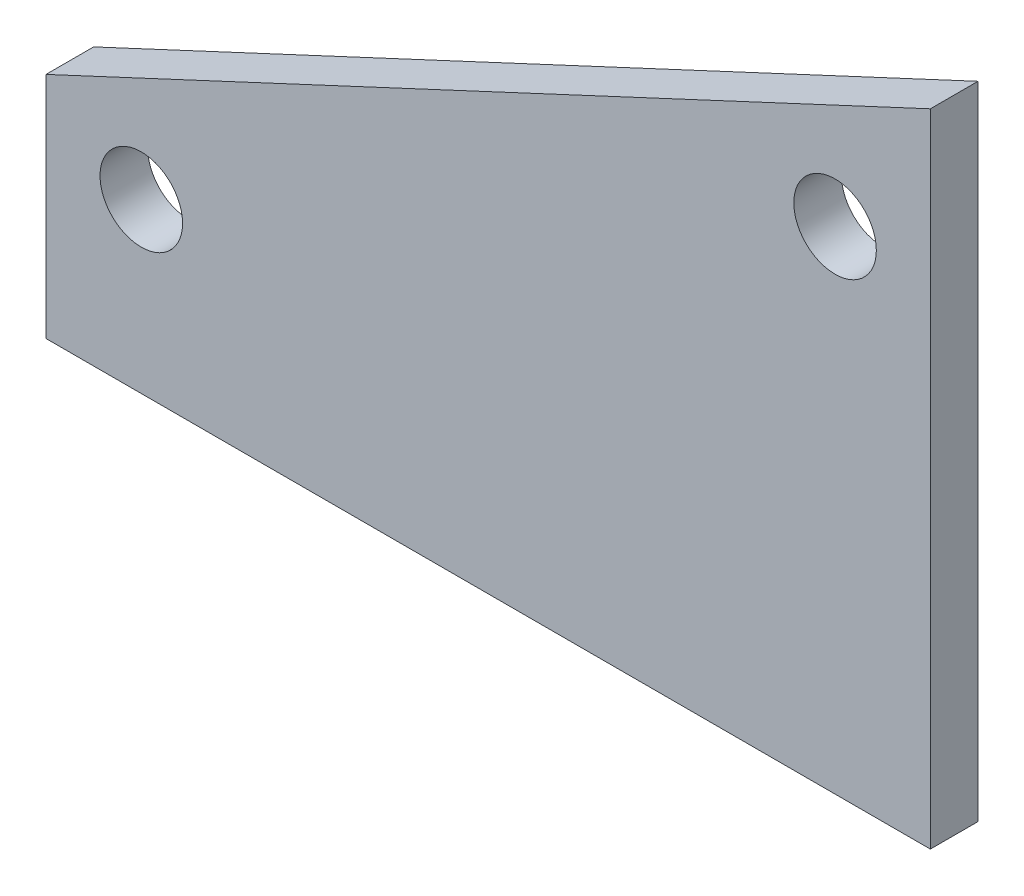
ISO-10303-21;
HEADER;
FILE_DESCRIPTION(('STEP AP214'),'2;1');
FILE_NAME('part.step','',(''),(''),'','','');
FILE_SCHEMA(('AUTOMOTIVE_DESIGN { 1 0 10303 214 1 1 1 1 }'));
ENDSEC;
DATA;
#1=APPLICATION_CONTEXT('core data for automotive mechanical design processes');
#2=APPLICATION_PROTOCOL_DEFINITION('international standard','automotive_design',2000,#1);
#3=PRODUCT_CONTEXT('',#1,'mechanical');
#4=PRODUCT('Part','Part','',(#3));
#5=PRODUCT_RELATED_PRODUCT_CATEGORY('part','',(#4));
#6=PRODUCT_DEFINITION_FORMATION('','',#4);
#7=PRODUCT_DEFINITION_CONTEXT('part definition',#1,'design');
#8=PRODUCT_DEFINITION('design','',#6,#7);
#9=PRODUCT_DEFINITION_SHAPE('','',#8);
#10=(LENGTH_UNIT() NAMED_UNIT(*) SI_UNIT(.MILLI.,.METRE.));
#11=(NAMED_UNIT(*) PLANE_ANGLE_UNIT() SI_UNIT($,.RADIAN.));
#12=(NAMED_UNIT(*) SI_UNIT($,.STERADIAN.) SOLID_ANGLE_UNIT());
#13=UNCERTAINTY_MEASURE_WITH_UNIT(LENGTH_MEASURE(1.E-05),#10,'distance_accuracy_value','');
#14=(GEOMETRIC_REPRESENTATION_CONTEXT(3) GLOBAL_UNCERTAINTY_ASSIGNED_CONTEXT((#13)) GLOBAL_UNIT_ASSIGNED_CONTEXT((#10,
#11,#12)) REPRESENTATION_CONTEXT('',''));
#15=CARTESIAN_POINT('',(0.,0.,0.));
#16=DIRECTION('',(0.,0.,1.));
#17=DIRECTION('',(1.,0.,0.));
#18=AXIS2_PLACEMENT_3D('',#15,#16,#17);
#19=CARTESIAN_POINT('',(-122.104796951643,0.,-3.175));
#20=DIRECTION('',(1.,0.,0.));
#21=DIRECTION('',(0.,0.,-1.));
#22=AXIS2_PLACEMENT_3D('',#19,#20,#21);
#23=PLANE('',#22);
#24=DIRECTION('',(0.,1.,0.));
#25=VECTOR('',#24,1.);
#26=CARTESIAN_POINT('',(-122.104796951643,0.,0.));
#27=LINE('',#26,#25);
#28=CARTESIAN_POINT('',(-122.104796951643,-176.121133645403,0.));
#29=VERTEX_POINT('',#28);
#30=CARTESIAN_POINT('',(-122.104796951643,-133.399898637297,0.));
#31=VERTEX_POINT('',#30);
#32=EDGE_CURVE('E115',#29,#31,#27,.T.);
#33=ORIENTED_EDGE('',*,*,#32,.F.);
#34=DIRECTION('',(0.,0.,1.));
#35=VECTOR('',#34,1.);
#36=CARTESIAN_POINT('',(-122.104796951643,-176.121133645403,-3.175));
#37=LINE('',#36,#35);
#38=CARTESIAN_POINT('',(-122.104796951643,-176.121133645403,-3.175));
#39=VERTEX_POINT('',#38);
#40=EDGE_CURVE('E11',#39,#29,#37,.T.);
#41=ORIENTED_EDGE('',*,*,#40,.F.);
#42=DIRECTION('',(0.,1.,0.));
#43=VECTOR('',#42,1.);
#44=CARTESIAN_POINT('',(-122.104796951643,0.,-3.175));
#45=LINE('',#44,#43);
#46=CARTESIAN_POINT('',(-122.104796951643,-133.399898637297,-3.175));
#47=VERTEX_POINT('',#46);
#48=EDGE_CURVE('E102',#39,#47,#45,.T.);
#49=ORIENTED_EDGE('',*,*,#48,.T.);
#50=DIRECTION('',(0.,0.,1.));
#51=VECTOR('',#50,1.);
#52=CARTESIAN_POINT('',(-122.104796951643,-133.399898637297,-3.175));
#53=LINE('',#52,#51);
#54=EDGE_CURVE('E47',#47,#31,#53,.T.);
#55=ORIENTED_EDGE('',*,*,#54,.T.);
#56=EDGE_LOOP('',(#33,#41,#49,#55));
#57=FACE_BOUND('',#56,.T.);
#58=ADVANCED_FACE('F43',(#57),#23,.T.);
#59=CARTESIAN_POINT('',(0.,-176.121133645403,-3.175));
#60=DIRECTION('',(0.,-1.,0.));
#61=DIRECTION('',(0.,0.,-1.));
#62=AXIS2_PLACEMENT_3D('',#59,#60,#61);
#63=PLANE('',#62);
#64=DIRECTION('',(1.,0.,0.));
#65=VECTOR('',#64,1.);
#66=CARTESIAN_POINT('',(0.,-176.121133645403,0.));
#67=LINE('',#66,#65);
#68=CARTESIAN_POINT('',(-181.032796951642,-176.121133645403,0.));
#69=VERTEX_POINT('',#68);
#70=EDGE_CURVE('E121',#69,#29,#67,.T.);
#71=ORIENTED_EDGE('',*,*,#70,.F.);
#72=DIRECTION('',(0.,0.,1.));
#73=VECTOR('',#72,1.);
#74=CARTESIAN_POINT('',(-181.032796951642,-176.121133645403,-3.175));
#75=LINE('',#74,#73);
#76=CARTESIAN_POINT('',(-181.032796951642,-176.121133645403,-3.175));
#77=VERTEX_POINT('',#76);
#78=EDGE_CURVE('E53',#77,#69,#75,.T.);
#79=ORIENTED_EDGE('',*,*,#78,.F.);
#80=DIRECTION('',(1.,0.,0.));
#81=VECTOR('',#80,1.);
#82=CARTESIAN_POINT('',(0.,-176.121133645403,-3.175));
#83=LINE('',#82,#81);
#84=EDGE_CURVE('E99',#77,#39,#83,.T.);
#85=ORIENTED_EDGE('',*,*,#84,.T.);
#86=ORIENTED_EDGE('',*,*,#40,.T.);
#87=EDGE_LOOP('',(#71,#79,#85,#86));
#88=FACE_BOUND('',#87,.T.);
#89=ADVANCED_FACE('F143',(#88),#63,.T.);
#90=CARTESIAN_POINT('',(-181.032796951642,0.,-3.175));
#91=DIRECTION('',(-1.,0.,0.));
#92=DIRECTION('',(0.,0.,1.));
#93=AXIS2_PLACEMENT_3D('',#90,#91,#92);
#94=PLANE('',#93);
#95=DIRECTION('',(0.,-1.,0.));
#96=VECTOR('',#95,1.);
#97=CARTESIAN_POINT('',(-181.032796951642,0.,0.));
#98=LINE('',#97,#96);
#99=CARTESIAN_POINT('',(-181.032796951642,-160.878476317055,0.));
#100=VERTEX_POINT('',#99);
#101=EDGE_CURVE('E94',#100,#69,#98,.T.);
#102=ORIENTED_EDGE('',*,*,#101,.F.);
#103=DIRECTION('',(0.,0.,1.));
#104=VECTOR('',#103,1.);
#105=CARTESIAN_POINT('',(-181.032796951642,-160.878476317055,-3.175));
#106=LINE('',#105,#104);
#107=CARTESIAN_POINT('',(-181.032796951642,-160.878476317055,-3.175));
#108=VERTEX_POINT('',#107);
#109=EDGE_CURVE('E89',#108,#100,#106,.T.);
#110=ORIENTED_EDGE('',*,*,#109,.F.);
#111=DIRECTION('',(0.,-1.,0.));
#112=VECTOR('',#111,1.);
#113=CARTESIAN_POINT('',(-181.032796951642,0.,-3.175));
#114=LINE('',#113,#112);
#115=EDGE_CURVE('E92',#108,#77,#114,.T.);
#116=ORIENTED_EDGE('',*,*,#115,.T.);
#117=ORIENTED_EDGE('',*,*,#78,.T.);
#118=EDGE_LOOP('',(#102,#110,#116,#117));
#119=FACE_BOUND('',#118,.T.);
#120=ADVANCED_FACE('F91',(#119),#94,.T.);
#121=CARTESIAN_POINT('',(-128.454796951643,-143.370341124406,-3.175));
#122=DIRECTION('',(0.,0.,1.));
#123=DIRECTION('',(1.,0.,0.));
#124=AXIS2_PLACEMENT_3D('',#121,#122,#123);
#125=CYLINDRICAL_SURFACE('',#124,2.75000000000001);
#126=CARTESIAN_POINT('',(-128.454796951643,-143.370341124406,-3.175));
#127=DIRECTION('',(0.,0.,1.));
#128=DIRECTION('',(1.,0.,0.));
#129=AXIS2_PLACEMENT_3D('',#126,#127,#128);
#130=CIRCLE('',#129,2.75000000000001);
#131=CARTESIAN_POINT('',(-125.704796951643,-143.370341124406,-3.175));
#132=VERTEX_POINT('',#131);
#133=EDGE_CURVE('E104',#132,#132,#130,.T.);
#134=ORIENTED_EDGE('',*,*,#133,.F.);
#135=EDGE_LOOP('',(#134));
#136=FACE_BOUND('',#135,.T.);
#137=CARTESIAN_POINT('',(-128.454796951643,-143.370341124406,0.));
#138=DIRECTION('',(0.,0.,1.));
#139=DIRECTION('',(1.,0.,0.));
#140=AXIS2_PLACEMENT_3D('',#137,#138,#139);
#141=CIRCLE('',#140,2.75000000000001);
#142=CARTESIAN_POINT('',(-125.704796951643,-143.370341124406,0.));
#143=VERTEX_POINT('',#142);
#144=EDGE_CURVE('E112',#143,#143,#141,.T.);
#145=ORIENTED_EDGE('',*,*,#144,.T.);
#146=EDGE_LOOP('',(#145));
#147=FACE_BOUND('',#146,.T.);
#148=ADVANCED_FACE('F134',(#136,#147),#125,.F.);
#149=CARTESIAN_POINT('',(-174.682796951642,-164.923872473181,-3.175));
#150=DIRECTION('',(0.,0.,1.));
#151=DIRECTION('',(1.,0.,0.));
#152=AXIS2_PLACEMENT_3D('',#149,#150,#151);
#153=CYLINDRICAL_SURFACE('',#152,2.75000000000001);
#154=CARTESIAN_POINT('',(-174.682796951642,-164.923872473181,-3.175));
#155=DIRECTION('',(0.,0.,1.));
#156=DIRECTION('',(1.,0.,0.));
#157=AXIS2_PLACEMENT_3D('',#154,#155,#156);
#158=CIRCLE('',#157,2.75000000000001);
#159=CARTESIAN_POINT('',(-171.932796951642,-164.923872473181,-3.175));
#160=VERTEX_POINT('',#159);
#161=EDGE_CURVE('E123',#160,#160,#158,.T.);
#162=ORIENTED_EDGE('',*,*,#161,.F.);
#163=EDGE_LOOP('',(#162));
#164=FACE_BOUND('',#163,.T.);
#165=CARTESIAN_POINT('',(-174.682796951642,-164.923872473181,0.));
#166=DIRECTION('',(0.,0.,1.));
#167=DIRECTION('',(1.,0.,0.));
#168=AXIS2_PLACEMENT_3D('',#165,#166,#167);
#169=CIRCLE('',#168,2.75000000000001);
#170=CARTESIAN_POINT('',(-171.932796951642,-164.923872473181,0.));
#171=VERTEX_POINT('',#170);
#172=EDGE_CURVE('E109',#171,#171,#169,.T.);
#173=ORIENTED_EDGE('',*,*,#172,.T.);
#174=EDGE_LOOP('',(#173));
#175=FACE_BOUND('',#174,.T.);
#176=ADVANCED_FACE('F45',(#164,#175),#153,.F.);
#177=CARTESIAN_POINT('',(29.28645233795,-62.8049997159053,-3.175));
#178=DIRECTION('',(-0.42261826174071,0.906307787036645,0.));
#179=DIRECTION('',(-0.906307787036645,-0.42261826174071,0.));
#180=AXIS2_PLACEMENT_3D('',#177,#178,#179);
#181=PLANE('',#180);
#182=DIRECTION('',(-0.906307787036645,-0.42261826174071,0.));
#183=VECTOR('',#182,1.);
#184=CARTESIAN_POINT('',(29.28645233795,-62.8049997159053,0.));
#185=LINE('',#184,#183);
#186=EDGE_CURVE('E118',#31,#100,#185,.T.);
#187=ORIENTED_EDGE('',*,*,#186,.F.);
#188=ORIENTED_EDGE('',*,*,#54,.F.);
#189=DIRECTION('',(-0.906307787036645,-0.42261826174071,0.));
#190=VECTOR('',#189,1.);
#191=CARTESIAN_POINT('',(29.28645233795,-62.8049997159053,-3.175));
#192=LINE('',#191,#190);
#193=EDGE_CURVE('E98',#47,#108,#192,.T.);
#194=ORIENTED_EDGE('',*,*,#193,.T.);
#195=ORIENTED_EDGE('',*,*,#109,.T.);
#196=EDGE_LOOP('',(#187,#188,#194,#195));
#197=FACE_BOUND('',#196,.T.);
#198=ADVANCED_FACE('F101',(#197),#181,.T.);
#199=CARTESIAN_POINT('',(0.,0.,-3.175));
#200=DIRECTION('',(0.,0.,1.));
#201=DIRECTION('',(1.,0.,0.));
#202=AXIS2_PLACEMENT_3D('',#199,#200,#201);
#203=PLANE('',#202);
#204=ORIENTED_EDGE('',*,*,#161,.T.);
#205=EDGE_LOOP('',(#204));
#206=FACE_BOUND('',#205,.T.);
#207=ORIENTED_EDGE('',*,*,#133,.T.);
#208=EDGE_LOOP('',(#207));
#209=FACE_BOUND('',#208,.T.);
#210=ORIENTED_EDGE('',*,*,#48,.F.);
#211=ORIENTED_EDGE('',*,*,#84,.F.);
#212=ORIENTED_EDGE('',*,*,#115,.F.);
#213=ORIENTED_EDGE('',*,*,#193,.F.);
#214=EDGE_LOOP('',(#210,#211,#212,#213));
#215=FACE_BOUND('',#214,.T.);
#216=ADVANCED_FACE('F97',(#206,#209,#215),#203,.F.);
#217=CARTESIAN_POINT('',(0.,0.,0.));
#218=DIRECTION('',(0.,0.,1.));
#219=DIRECTION('',(1.,0.,0.));
#220=AXIS2_PLACEMENT_3D('',#217,#218,#219);
#221=PLANE('',#220);
#222=ORIENTED_EDGE('',*,*,#172,.F.);
#223=EDGE_LOOP('',(#222));
#224=FACE_BOUND('',#223,.T.);
#225=ORIENTED_EDGE('',*,*,#144,.F.);
#226=EDGE_LOOP('',(#225));
#227=FACE_BOUND('',#226,.T.);
#228=ORIENTED_EDGE('',*,*,#32,.T.);
#229=ORIENTED_EDGE('',*,*,#186,.T.);
#230=ORIENTED_EDGE('',*,*,#101,.T.);
#231=ORIENTED_EDGE('',*,*,#70,.T.);
#232=EDGE_LOOP('',(#228,#229,#230,#231));
#233=FACE_BOUND('',#232,.T.);
#234=ADVANCED_FACE('F139',(#224,#227,#233),#221,.T.);
#235=CLOSED_SHELL('',(#58,#89,#120,#148,#176,#198,#216,#234));
#236=MANIFOLD_SOLID_BREP('B2',#235);
#237=ADVANCED_BREP_SHAPE_REPRESENTATION('',(#18,#236),#14);
#238=SHAPE_DEFINITION_REPRESENTATION(#9,#237);
ENDSEC;
END-ISO-10303-21;
